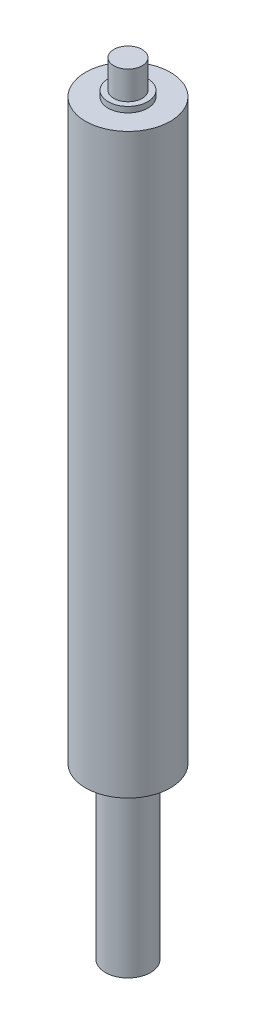
ISO-10303-21;
HEADER;
FILE_DESCRIPTION(('STEP AP214'),'2;1');
FILE_NAME('part.step','',(''),(''),'','','');
FILE_SCHEMA(('AUTOMOTIVE_DESIGN { 1 0 10303 214 1 1 1 1 }'));
ENDSEC;
DATA;
#1=APPLICATION_CONTEXT('core data for automotive mechanical design processes');
#2=APPLICATION_PROTOCOL_DEFINITION('international standard','automotive_design',2000,#1);
#3=PRODUCT_CONTEXT('',#1,'mechanical');
#4=PRODUCT('Part','Part','',(#3));
#5=PRODUCT_RELATED_PRODUCT_CATEGORY('part','',(#4));
#6=PRODUCT_DEFINITION_FORMATION('','',#4);
#7=PRODUCT_DEFINITION_CONTEXT('part definition',#1,'design');
#8=PRODUCT_DEFINITION('design','',#6,#7);
#9=PRODUCT_DEFINITION_SHAPE('','',#8);
#10=(LENGTH_UNIT() NAMED_UNIT(*) SI_UNIT(.MILLI.,.METRE.));
#11=(NAMED_UNIT(*) PLANE_ANGLE_UNIT() SI_UNIT($,.RADIAN.));
#12=(NAMED_UNIT(*) SI_UNIT($,.STERADIAN.) SOLID_ANGLE_UNIT());
#13=UNCERTAINTY_MEASURE_WITH_UNIT(LENGTH_MEASURE(1.E-05),#10,'distance_accuracy_value','');
#14=(GEOMETRIC_REPRESENTATION_CONTEXT(3) GLOBAL_UNCERTAINTY_ASSIGNED_CONTEXT((#13)) GLOBAL_UNIT_ASSIGNED_CONTEXT((#10,
#11,#12)) REPRESENTATION_CONTEXT('',''));
#15=CARTESIAN_POINT('',(0.,0.,0.));
#16=DIRECTION('',(0.,0.,1.));
#17=DIRECTION('',(1.,0.,0.));
#18=AXIS2_PLACEMENT_3D('',#15,#16,#17);
#19=CARTESIAN_POINT('',(0.,102.,0.));
#20=DIRECTION('',(0.,-1.,0.));
#21=DIRECTION('',(0.,0.,-1.));
#22=AXIS2_PLACEMENT_3D('',#19,#20,#21);
#23=CYLINDRICAL_SURFACE('',#22,7.5);
#24=CARTESIAN_POINT('',(0.,102.,0.));
#25=DIRECTION('',(0.,1.,0.));
#26=DIRECTION('',(0.,0.,1.));
#27=AXIS2_PLACEMENT_3D('',#24,#25,#26);
#28=CIRCLE('',#27,7.5);
#29=CARTESIAN_POINT('',(0.,102.,7.5));
#30=VERTEX_POINT('',#29);
#31=EDGE_CURVE('E65',#30,#30,#28,.T.);
#32=ORIENTED_EDGE('',*,*,#31,.F.);
#33=EDGE_LOOP('',(#32));
#34=FACE_BOUND('',#33,.T.);
#35=CARTESIAN_POINT('',(0.,0.,0.));
#36=DIRECTION('',(0.,1.,0.));
#37=DIRECTION('',(0.,0.,1.));
#38=AXIS2_PLACEMENT_3D('',#35,#36,#37);
#39=CIRCLE('',#38,7.5);
#40=CARTESIAN_POINT('',(0.,0.,7.5));
#41=VERTEX_POINT('',#40);
#42=EDGE_CURVE('E38',#41,#41,#39,.T.);
#43=ORIENTED_EDGE('',*,*,#42,.T.);
#44=EDGE_LOOP('',(#43));
#45=FACE_BOUND('',#44,.T.);
#46=ADVANCED_FACE('F35',(#34,#45),#23,.T.);
#47=CARTESIAN_POINT('',(0.,102.,0.));
#48=DIRECTION('',(0.,1.,0.));
#49=DIRECTION('',(0.,0.,1.));
#50=AXIS2_PLACEMENT_3D('',#47,#48,#49);
#51=PLANE('',#50);
#52=CARTESIAN_POINT('',(0.,102.,0.));
#53=DIRECTION('',(0.,1.,0.));
#54=DIRECTION('',(0.,0.,1.));
#55=AXIS2_PLACEMENT_3D('',#52,#53,#54);
#56=CIRCLE('',#55,3.5);
#57=CARTESIAN_POINT('',(0.,102.,3.5));
#58=VERTEX_POINT('',#57);
#59=EDGE_CURVE('E42',#58,#58,#56,.T.);
#60=ORIENTED_EDGE('',*,*,#59,.F.);
#61=EDGE_LOOP('',(#60));
#62=FACE_BOUND('',#61,.T.);
#63=ORIENTED_EDGE('',*,*,#31,.T.);
#64=EDGE_LOOP('',(#63));
#65=FACE_BOUND('',#64,.T.);
#66=ADVANCED_FACE('F76',(#62,#65),#51,.T.);
#67=CARTESIAN_POINT('',(0.,0.,0.));
#68=DIRECTION('',(0.,1.,0.));
#69=DIRECTION('',(0.,0.,1.));
#70=AXIS2_PLACEMENT_3D('',#67,#68,#69);
#71=PLANE('',#70);
#72=CARTESIAN_POINT('',(0.,0.,0.));
#73=DIRECTION('',(0.,-1.,0.));
#74=DIRECTION('',(0.,0.,-1.));
#75=AXIS2_PLACEMENT_3D('',#72,#73,#74);
#76=CIRCLE('',#75,5.);
#77=CARTESIAN_POINT('',(0.,0.,-5.));
#78=VERTEX_POINT('',#77);
#79=EDGE_CURVE('E61',#78,#78,#76,.T.);
#80=ORIENTED_EDGE('',*,*,#79,.F.);
#81=EDGE_LOOP('',(#80));
#82=FACE_BOUND('',#81,.T.);
#83=ORIENTED_EDGE('',*,*,#42,.F.);
#84=EDGE_LOOP('',(#83));
#85=FACE_BOUND('',#84,.T.);
#86=ADVANCED_FACE('F73',(#82,#85),#71,.F.);
#87=CARTESIAN_POINT('',(0.,-1.,0.));
#88=DIRECTION('',(0.,1.,0.));
#89=DIRECTION('',(0.,0.,1.));
#90=AXIS2_PLACEMENT_3D('',#87,#88,#89);
#91=CYLINDRICAL_SURFACE('',#90,5.);
#92=CARTESIAN_POINT('',(0.,-1.,0.));
#93=DIRECTION('',(0.,-1.,0.));
#94=DIRECTION('',(0.,0.,-1.));
#95=AXIS2_PLACEMENT_3D('',#92,#93,#94);
#96=CIRCLE('',#95,5.);
#97=CARTESIAN_POINT('',(0.,-1.,-5.));
#98=VERTEX_POINT('',#97);
#99=EDGE_CURVE('E58',#98,#98,#96,.T.);
#100=ORIENTED_EDGE('',*,*,#99,.F.);
#101=EDGE_LOOP('',(#100));
#102=FACE_BOUND('',#101,.T.);
#103=ORIENTED_EDGE('',*,*,#79,.T.);
#104=EDGE_LOOP('',(#103));
#105=FACE_BOUND('',#104,.T.);
#106=ADVANCED_FACE('F75',(#102,#105),#91,.T.);
#107=CARTESIAN_POINT('',(0.,-1.,0.));
#108=DIRECTION('',(0.,-1.,0.));
#109=DIRECTION('',(0.,0.,-1.));
#110=AXIS2_PLACEMENT_3D('',#107,#108,#109);
#111=PLANE('',#110);
#112=CARTESIAN_POINT('',(0.,-1.,0.));
#113=DIRECTION('',(0.,-1.,0.));
#114=DIRECTION('',(0.,0.,-1.));
#115=AXIS2_PLACEMENT_3D('',#112,#113,#114);
#116=CIRCLE('',#115,4.);
#117=CARTESIAN_POINT('',(0.,-1.,4.));
#118=VERTEX_POINT('',#117);
#119=EDGE_CURVE('E47',#118,#118,#116,.T.);
#120=ORIENTED_EDGE('',*,*,#119,.F.);
#121=EDGE_LOOP('',(#120));
#122=FACE_BOUND('',#121,.T.);
#123=ORIENTED_EDGE('',*,*,#99,.T.);
#124=EDGE_LOOP('',(#123));
#125=FACE_BOUND('',#124,.T.);
#126=ADVANCED_FACE('F82',(#122,#125),#111,.T.);
#127=CARTESIAN_POINT('',(0.,-30.,0.));
#128=DIRECTION('',(0.,1.,0.));
#129=DIRECTION('',(0.,0.,1.));
#130=AXIS2_PLACEMENT_3D('',#127,#128,#129);
#131=CYLINDRICAL_SURFACE('',#130,4.);
#132=CARTESIAN_POINT('',(0.,-30.,0.));
#133=DIRECTION('',(0.,-1.,0.));
#134=DIRECTION('',(0.,0.,-1.));
#135=AXIS2_PLACEMENT_3D('',#132,#133,#134);
#136=CIRCLE('',#135,4.);
#137=CARTESIAN_POINT('',(0.,-30.,4.));
#138=VERTEX_POINT('',#137);
#139=EDGE_CURVE('E54',#138,#138,#136,.T.);
#140=CARTESIAN_POINT('',(0.,-30.,4.));
#141=CARTESIAN_POINT('',(0.,-29.6979166666667,4.));
#142=CARTESIAN_POINT('',(0.,-29.3958333333333,4.));
#143=CARTESIAN_POINT('',(0.,-28.7916666666667,4.));
#144=CARTESIAN_POINT('',(0.,-28.4895833333333,4.));
#145=CARTESIAN_POINT('',(0.,-27.8854166666667,4.));
#146=CARTESIAN_POINT('',(0.,-27.5833333333333,4.));
#147=CARTESIAN_POINT('',(0.,-26.9791666666667,4.));
#148=CARTESIAN_POINT('',(0.,-26.6770833333333,4.));
#149=CARTESIAN_POINT('',(0.,-26.0729166666667,4.));
#150=CARTESIAN_POINT('',(0.,-25.7708333333333,4.));
#151=CARTESIAN_POINT('',(0.,-25.1666666666667,4.));
#152=CARTESIAN_POINT('',(0.,-24.8645833333333,4.));
#153=CARTESIAN_POINT('',(0.,-24.2604166666667,4.));
#154=CARTESIAN_POINT('',(0.,-23.9583333333333,4.));
#155=CARTESIAN_POINT('',(0.,-23.3541666666667,4.));
#156=CARTESIAN_POINT('',(0.,-23.0520833333333,4.));
#157=CARTESIAN_POINT('',(0.,-22.4479166666667,4.));
#158=CARTESIAN_POINT('',(0.,-22.1458333333333,4.));
#159=CARTESIAN_POINT('',(0.,-21.5416666666667,4.));
#160=CARTESIAN_POINT('',(0.,-21.2395833333333,4.));
#161=CARTESIAN_POINT('',(0.,-20.6354166666667,4.));
#162=CARTESIAN_POINT('',(0.,-20.3333333333333,4.));
#163=CARTESIAN_POINT('',(0.,-19.7291666666667,4.));
#164=CARTESIAN_POINT('',(0.,-19.4270833333333,4.));
#165=CARTESIAN_POINT('',(0.,-18.8229166666667,4.));
#166=CARTESIAN_POINT('',(0.,-18.5208333333333,4.));
#167=CARTESIAN_POINT('',(0.,-17.9166666666667,4.));
#168=CARTESIAN_POINT('',(0.,-17.6145833333333,4.));
#169=CARTESIAN_POINT('',(0.,-17.0104166666667,4.));
#170=CARTESIAN_POINT('',(0.,-16.7083333333333,4.));
#171=CARTESIAN_POINT('',(0.,-16.1041666666667,4.));
#172=CARTESIAN_POINT('',(0.,-15.8020833333333,4.));
#173=CARTESIAN_POINT('',(0.,-15.1979166666667,4.));
#174=CARTESIAN_POINT('',(0.,-14.8958333333333,4.));
#175=CARTESIAN_POINT('',(0.,-14.2916666666667,4.));
#176=CARTESIAN_POINT('',(0.,-13.9895833333333,4.));
#177=CARTESIAN_POINT('',(0.,-13.3854166666667,4.));
#178=CARTESIAN_POINT('',(0.,-13.0833333333333,4.));
#179=CARTESIAN_POINT('',(0.,-12.4791666666667,4.));
#180=CARTESIAN_POINT('',(0.,-12.1770833333333,4.));
#181=CARTESIAN_POINT('',(0.,-11.5729166666667,4.));
#182=CARTESIAN_POINT('',(0.,-11.2708333333333,4.));
#183=CARTESIAN_POINT('',(0.,-10.6666666666667,4.));
#184=CARTESIAN_POINT('',(0.,-10.3645833333333,4.));
#185=CARTESIAN_POINT('',(0.,-9.76041666666667,4.));
#186=CARTESIAN_POINT('',(0.,-9.45833333333333,4.));
#187=CARTESIAN_POINT('',(0.,-8.85416666666667,4.));
#188=CARTESIAN_POINT('',(0.,-8.55208333333333,4.));
#189=CARTESIAN_POINT('',(0.,-7.94791666666667,4.));
#190=CARTESIAN_POINT('',(0.,-7.64583333333333,4.));
#191=CARTESIAN_POINT('',(0.,-7.04166666666667,4.));
#192=CARTESIAN_POINT('',(0.,-6.73958333333333,4.));
#193=CARTESIAN_POINT('',(0.,-6.13541666666667,4.));
#194=CARTESIAN_POINT('',(0.,-5.83333333333334,4.));
#195=CARTESIAN_POINT('',(0.,-5.22916666666667,4.));
#196=CARTESIAN_POINT('',(0.,-4.92708333333333,4.));
#197=CARTESIAN_POINT('',(0.,-4.32291666666667,4.));
#198=CARTESIAN_POINT('',(0.,-4.02083333333333,4.));
#199=CARTESIAN_POINT('',(0.,-3.41666666666667,4.));
#200=CARTESIAN_POINT('',(0.,-3.11458333333333,4.));
#201=CARTESIAN_POINT('',(0.,-2.51041666666667,4.));
#202=CARTESIAN_POINT('',(0.,-2.20833333333334,4.));
#203=CARTESIAN_POINT('',(0.,-1.60416666666667,4.));
#204=CARTESIAN_POINT('',(0.,-1.30208333333333,4.));
#205=CARTESIAN_POINT('',(0.,-1.,4.));
#206=B_SPLINE_CURVE_WITH_KNOTS('',3,(#140,#141,#142,#143,#144,#145,#146,#147,#148,#149,#150,
#151,#152,#153,#154,#155,#156,#157,#158,#159,#160,#161,#162,#163,#164,#165,#166,#167,#168,#169,
#170,#171,#172,#173,#174,#175,#176,#177,#178,#179,#180,#181,#182,#183,#184,#185,#186,#187,#188,
#189,#190,#191,#192,#193,#194,#195,#196,#197,#198,#199,#200,#201,#202,#203,#204,#205),
.UNSPECIFIED.,.F.,.F.,(4,2,2,2,2,2,2,2,2,2,2,2,2,2,2,2,2,2,2,2,2,2,2,2,2,2,2,2,2,2,2,2,4),(0.,
0.906249999999997,1.8125,2.71875,3.625,4.53125,5.4375,6.34375,7.25,8.15625,9.0625,9.96875,
10.875,11.78125,12.6875,13.59375,14.5,15.40625,16.3125,17.21875,18.125,19.03125,19.9375,
20.84375,21.75,22.65625,23.5625,24.46875,25.375,26.28125,27.1875,28.09375,29.),.UNSPECIFIED.);
#207=EDGE_CURVE('BSEAM159',#138,#118,#206,.T.);
#208=ORIENTED_EDGE('',*,*,#139,.F.);
#209=ORIENTED_EDGE('',*,*,#119,.T.);
#210=ORIENTED_EDGE('',*,*,#207,.T.);
#211=ORIENTED_EDGE('',*,*,#207,.F.);
#212=EDGE_LOOP('',(#208,#210,#209,#211));
#213=FACE_BOUND('',#212,.T.);
#214=ADVANCED_FACE('F159',(#213),#131,.T.);
#215=CARTESIAN_POINT('',(0.,-30.,0.));
#216=DIRECTION('',(0.,-1.,0.));
#217=DIRECTION('',(0.,0.,-1.));
#218=AXIS2_PLACEMENT_3D('',#215,#216,#217);
#219=PLANE('',#218);
#220=ORIENTED_EDGE('',*,*,#139,.T.);
#221=EDGE_LOOP('',(#220));
#222=FACE_BOUND('',#221,.T.);
#223=ADVANCED_FACE('F104',(#222),#219,.T.);
#224=CARTESIAN_POINT('',(0.,103.,0.));
#225=DIRECTION('',(0.,-1.,0.));
#226=DIRECTION('',(0.,0.,-1.));
#227=AXIS2_PLACEMENT_3D('',#224,#225,#226);
#228=CYLINDRICAL_SURFACE('',#227,3.5);
#229=CARTESIAN_POINT('',(0.,103.,0.));
#230=DIRECTION('',(0.,1.,0.));
#231=DIRECTION('',(0.,0.,1.));
#232=AXIS2_PLACEMENT_3D('',#229,#230,#231);
#233=CIRCLE('',#232,3.5);
#234=CARTESIAN_POINT('',(0.,103.,3.5));
#235=VERTEX_POINT('',#234);
#236=EDGE_CURVE('E52',#235,#235,#233,.T.);
#237=ORIENTED_EDGE('',*,*,#236,.F.);
#238=EDGE_LOOP('',(#237));
#239=FACE_BOUND('',#238,.T.);
#240=ORIENTED_EDGE('',*,*,#59,.T.);
#241=EDGE_LOOP('',(#240));
#242=FACE_BOUND('',#241,.T.);
#243=ADVANCED_FACE('F109',(#239,#242),#228,.T.);
#244=CARTESIAN_POINT('',(0.,103.,0.));
#245=DIRECTION('',(0.,1.,0.));
#246=DIRECTION('',(0.,0.,1.));
#247=AXIS2_PLACEMENT_3D('',#244,#245,#246);
#248=PLANE('',#247);
#249=CARTESIAN_POINT('',(0.,103.,0.));
#250=DIRECTION('',(0.,1.,0.));
#251=DIRECTION('',(0.,0.,1.));
#252=AXIS2_PLACEMENT_3D('',#249,#250,#251);
#253=CIRCLE('',#252,2.5);
#254=CARTESIAN_POINT('',(0.,103.,2.5));
#255=VERTEX_POINT('',#254);
#256=EDGE_CURVE('E10',#255,#255,#253,.T.);
#257=ORIENTED_EDGE('',*,*,#256,.F.);
#258=EDGE_LOOP('',(#257));
#259=FACE_BOUND('',#258,.T.);
#260=ORIENTED_EDGE('',*,*,#236,.T.);
#261=EDGE_LOOP('',(#260));
#262=FACE_BOUND('',#261,.T.);
#263=ADVANCED_FACE('F114',(#259,#262),#248,.T.);
#264=CARTESIAN_POINT('',(0.,108.,0.));
#265=DIRECTION('',(0.,-1.,0.));
#266=DIRECTION('',(0.,0.,-1.));
#267=AXIS2_PLACEMENT_3D('',#264,#265,#266);
#268=CYLINDRICAL_SURFACE('',#267,2.5);
#269=CARTESIAN_POINT('',(0.,108.,0.));
#270=DIRECTION('',(0.,1.,0.));
#271=DIRECTION('',(0.,0.,1.));
#272=AXIS2_PLACEMENT_3D('',#269,#270,#271);
#273=CIRCLE('',#272,2.5);
#274=CARTESIAN_POINT('',(0.,108.,2.5));
#275=VERTEX_POINT('',#274);
#276=EDGE_CURVE('E51',#275,#275,#273,.T.);
#277=ORIENTED_EDGE('',*,*,#276,.F.);
#278=EDGE_LOOP('',(#277));
#279=FACE_BOUND('',#278,.T.);
#280=ORIENTED_EDGE('',*,*,#256,.T.);
#281=EDGE_LOOP('',(#280));
#282=FACE_BOUND('',#281,.T.);
#283=ADVANCED_FACE('F125',(#279,#282),#268,.T.);
#284=CARTESIAN_POINT('',(0.,108.,0.));
#285=DIRECTION('',(0.,1.,0.));
#286=DIRECTION('',(0.,0.,1.));
#287=AXIS2_PLACEMENT_3D('',#284,#285,#286);
#288=PLANE('',#287);
#289=ORIENTED_EDGE('',*,*,#276,.T.);
#290=EDGE_LOOP('',(#289));
#291=FACE_BOUND('',#290,.T.);
#292=ADVANCED_FACE('F136',(#291),#288,.T.);
#293=CLOSED_SHELL('',(#46,#66,#86,#106,#126,#214,#223,#243,#263,#283,#292));
#294=MANIFOLD_SOLID_BREP('B2',#293);
#295=ADVANCED_BREP_SHAPE_REPRESENTATION('',(#18,#294),#14);
#296=SHAPE_DEFINITION_REPRESENTATION(#9,#295);
ENDSEC;
END-ISO-10303-21;
